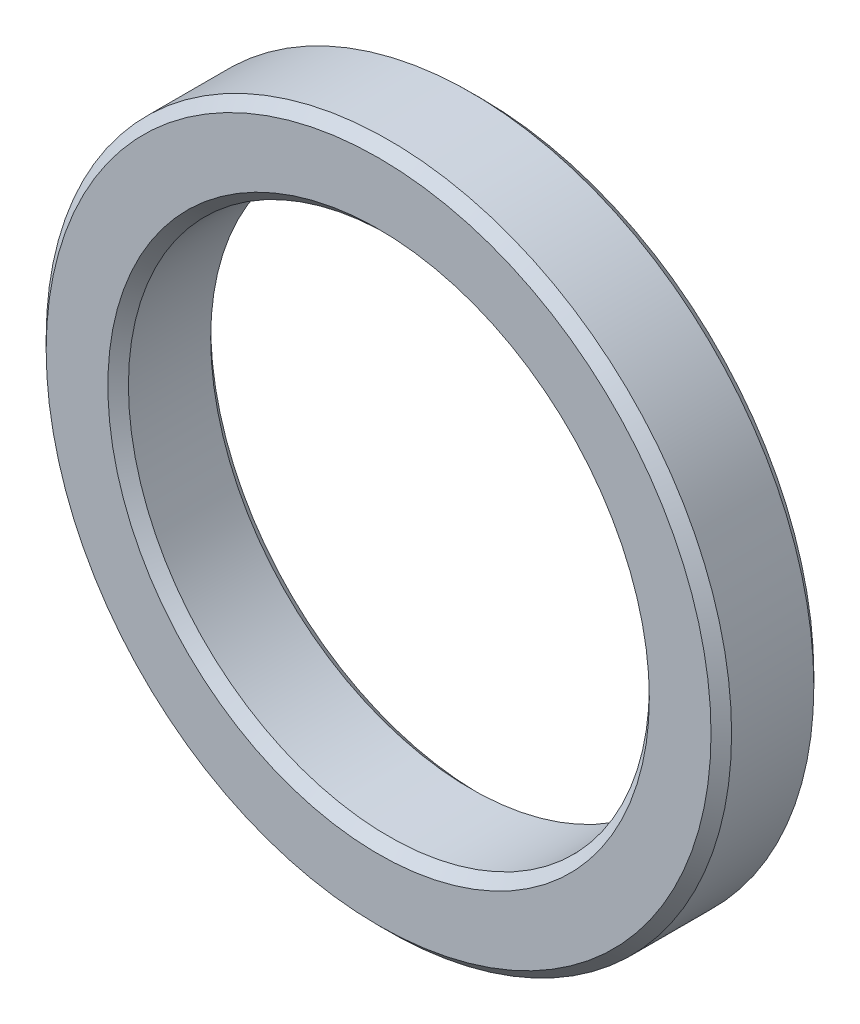
ISO-10303-21;
HEADER;
FILE_DESCRIPTION(('STEP AP214'),'2;1');
FILE_NAME('part.step','',(''),(''),'','','');
FILE_SCHEMA(('AUTOMOTIVE_DESIGN { 1 0 10303 214 1 1 1 1 }'));
ENDSEC;
DATA;
#1=APPLICATION_CONTEXT('core data for automotive mechanical design processes');
#2=APPLICATION_PROTOCOL_DEFINITION('international standard','automotive_design',2000,#1);
#3=PRODUCT_CONTEXT('',#1,'mechanical');
#4=PRODUCT('Part','Part','',(#3));
#5=PRODUCT_RELATED_PRODUCT_CATEGORY('part','',(#4));
#6=PRODUCT_DEFINITION_FORMATION('','',#4);
#7=PRODUCT_DEFINITION_CONTEXT('part definition',#1,'design');
#8=PRODUCT_DEFINITION('design','',#6,#7);
#9=PRODUCT_DEFINITION_SHAPE('','',#8);
#10=(LENGTH_UNIT() NAMED_UNIT(*) SI_UNIT(.MILLI.,.METRE.));
#11=(NAMED_UNIT(*) PLANE_ANGLE_UNIT() SI_UNIT($,.RADIAN.));
#12=(NAMED_UNIT(*) SI_UNIT($,.STERADIAN.) SOLID_ANGLE_UNIT());
#13=UNCERTAINTY_MEASURE_WITH_UNIT(LENGTH_MEASURE(1.E-05),#10,'distance_accuracy_value','');
#14=(GEOMETRIC_REPRESENTATION_CONTEXT(3) GLOBAL_UNCERTAINTY_ASSIGNED_CONTEXT((#13)) GLOBAL_UNIT_ASSIGNED_CONTEXT((#10,
#11,#12)) REPRESENTATION_CONTEXT('',''));
#15=CARTESIAN_POINT('',(0.,0.,0.));
#16=DIRECTION('',(0.,0.,1.));
#17=DIRECTION('',(1.,0.,0.));
#18=AXIS2_PLACEMENT_3D('',#15,#16,#17);
#19=CARTESIAN_POINT('',(0.,0.,3.));
#20=DIRECTION('',(0.,0.,1.));
#21=DIRECTION('',(1.,0.,0.));
#22=AXIS2_PLACEMENT_3D('',#19,#20,#21);
#23=PLANE('',#22);
#24=CARTESIAN_POINT('',(0.,0.,3.));
#25=DIRECTION('',(0.,0.,1.));
#26=DIRECTION('',(1.,0.,0.));
#27=AXIS2_PLACEMENT_3D('',#24,#25,#26);
#28=CIRCLE('',#27,9.7);
#29=CARTESIAN_POINT('',(9.7,0.,3.));
#30=VERTEX_POINT('',#29);
#31=EDGE_CURVE('E39',#30,#30,#28,.T.);
#32=ORIENTED_EDGE('',*,*,#31,.T.);
#33=EDGE_LOOP('',(#32));
#34=FACE_BOUND('',#33,.T.);
#35=CARTESIAN_POINT('',(0.,0.,3.));
#36=DIRECTION('',(0.,0.,1.));
#37=DIRECTION('',(1.,0.,0.));
#38=AXIS2_PLACEMENT_3D('',#35,#36,#37);
#39=CIRCLE('',#38,7.9);
#40=CARTESIAN_POINT('',(7.9,0.,3.));
#41=VERTEX_POINT('',#40);
#42=EDGE_CURVE('E43',#41,#41,#39,.F.);
#43=ORIENTED_EDGE('',*,*,#42,.T.);
#44=EDGE_LOOP('',(#43));
#45=FACE_BOUND('',#44,.T.);
#46=ADVANCED_FACE('F28',(#34,#45),#23,.T.);
#47=CARTESIAN_POINT('',(0.,0.,0.));
#48=DIRECTION('',(0.,0.,1.));
#49=DIRECTION('',(1.,0.,0.));
#50=AXIS2_PLACEMENT_3D('',#47,#48,#49);
#51=PLANE('',#50);
#52=CARTESIAN_POINT('',(0.,0.,0.));
#53=DIRECTION('',(0.,0.,1.));
#54=DIRECTION('',(1.,0.,0.));
#55=AXIS2_PLACEMENT_3D('',#52,#53,#54);
#56=CIRCLE('',#55,9.7);
#57=CARTESIAN_POINT('',(9.7,0.,0.));
#58=VERTEX_POINT('',#57);
#59=EDGE_CURVE('E48',#58,#58,#56,.F.);
#60=ORIENTED_EDGE('',*,*,#59,.T.);
#61=EDGE_LOOP('',(#60));
#62=FACE_BOUND('',#61,.T.);
#63=CARTESIAN_POINT('',(0.,0.,0.));
#64=DIRECTION('',(0.,0.,1.));
#65=DIRECTION('',(1.,0.,0.));
#66=AXIS2_PLACEMENT_3D('',#63,#64,#65);
#67=CIRCLE('',#66,7.9);
#68=CARTESIAN_POINT('',(7.9,0.,0.));
#69=VERTEX_POINT('',#68);
#70=EDGE_CURVE('E51',#69,#69,#67,.T.);
#71=ORIENTED_EDGE('',*,*,#70,.T.);
#72=EDGE_LOOP('',(#71));
#73=FACE_BOUND('',#72,.T.);
#74=ADVANCED_FACE('F73',(#62,#73),#51,.F.);
#75=CARTESIAN_POINT('',(0.,0.,3.));
#76=DIRECTION('',(0.,0.,-1.));
#77=DIRECTION('',(-1.,0.,0.));
#78=AXIS2_PLACEMENT_3D('',#75,#76,#77);
#79=CYLINDRICAL_SURFACE('',#78,10.);
#80=CARTESIAN_POINT('',(0.,0.,0.3));
#81=DIRECTION('',(0.,0.,1.));
#82=DIRECTION('',(1.,0.,0.));
#83=AXIS2_PLACEMENT_3D('',#80,#81,#82);
#84=CIRCLE('',#83,10.);
#85=CARTESIAN_POINT('',(10.,0.,0.3));
#86=VERTEX_POINT('',#85);
#87=EDGE_CURVE('E54',#86,#86,#84,.T.);
#88=ORIENTED_EDGE('',*,*,#87,.T.);
#89=EDGE_LOOP('',(#88));
#90=FACE_BOUND('',#89,.T.);
#91=CARTESIAN_POINT('',(0.,0.,2.7));
#92=DIRECTION('',(0.,0.,1.));
#93=DIRECTION('',(1.,0.,0.));
#94=AXIS2_PLACEMENT_3D('',#91,#92,#93);
#95=CIRCLE('',#94,10.);
#96=CARTESIAN_POINT('',(10.,0.,2.7));
#97=VERTEX_POINT('',#96);
#98=EDGE_CURVE('E57',#97,#97,#95,.F.);
#99=ORIENTED_EDGE('',*,*,#98,.T.);
#100=EDGE_LOOP('',(#99));
#101=FACE_BOUND('',#100,.T.);
#102=ADVANCED_FACE('F61',(#90,#101),#79,.T.);
#103=CARTESIAN_POINT('',(0.,0.,3.));
#104=DIRECTION('',(0.,0.,-1.));
#105=DIRECTION('',(-1.,0.,0.));
#106=AXIS2_PLACEMENT_3D('',#103,#104,#105);
#107=CYLINDRICAL_SURFACE('',#106,7.6);
#108=CARTESIAN_POINT('',(0.,0.,0.299999999999998));
#109=DIRECTION('',(0.,0.,1.));
#110=DIRECTION('',(1.,0.,0.));
#111=AXIS2_PLACEMENT_3D('',#108,#109,#110);
#112=CIRCLE('',#111,7.6);
#113=CARTESIAN_POINT('',(7.6,0.,0.299999999999998));
#114=VERTEX_POINT('',#113);
#115=EDGE_CURVE('E10',#114,#114,#112,.F.);
#116=ORIENTED_EDGE('',*,*,#115,.T.);
#117=EDGE_LOOP('',(#116));
#118=FACE_BOUND('',#117,.T.);
#119=CARTESIAN_POINT('',(0.,0.,2.70000000000001));
#120=DIRECTION('',(0.,0.,1.));
#121=DIRECTION('',(1.,0.,0.));
#122=AXIS2_PLACEMENT_3D('',#119,#120,#121);
#123=CIRCLE('',#122,7.6);
#124=CARTESIAN_POINT('',(7.6,0.,2.70000000000001));
#125=VERTEX_POINT('',#124);
#126=EDGE_CURVE('E35',#125,#125,#123,.T.);
#127=ORIENTED_EDGE('',*,*,#126,.T.);
#128=EDGE_LOOP('',(#127));
#129=FACE_BOUND('',#128,.T.);
#130=ADVANCED_FACE('F89',(#118,#129),#107,.F.);
#131=CARTESIAN_POINT('',(0.,0.,0.3));
#132=DIRECTION('',(0.,0.,1.));
#133=DIRECTION('',(1.,0.,0.));
#134=AXIS2_PLACEMENT_3D('',#131,#132,#133);
#135=CONICAL_SURFACE('',#134,10.,0.785398163397451);
#136=ORIENTED_EDGE('',*,*,#59,.F.);
#137=EDGE_LOOP('',(#136));
#138=FACE_BOUND('',#137,.T.);
#139=ORIENTED_EDGE('',*,*,#87,.F.);
#140=EDGE_LOOP('',(#139));
#141=FACE_BOUND('',#140,.T.);
#142=ADVANCED_FACE('F67',(#138,#141),#135,.T.);
#143=CARTESIAN_POINT('',(0.,0.,3.));
#144=DIRECTION('',(0.,0.,-1.));
#145=DIRECTION('',(-1.,0.,0.));
#146=AXIS2_PLACEMENT_3D('',#143,#144,#145);
#147=CONICAL_SURFACE('',#146,9.7,0.785398163397443);
#148=ORIENTED_EDGE('',*,*,#98,.F.);
#149=EDGE_LOOP('',(#148));
#150=FACE_BOUND('',#149,.T.);
#151=ORIENTED_EDGE('',*,*,#31,.F.);
#152=EDGE_LOOP('',(#151));
#153=FACE_BOUND('',#152,.T.);
#154=ADVANCED_FACE('F63',(#150,#153),#147,.T.);
#155=CARTESIAN_POINT('',(0.,0.,0.));
#156=DIRECTION('',(0.,0.,-1.));
#157=DIRECTION('',(-1.,0.,0.));
#158=AXIS2_PLACEMENT_3D('',#155,#156,#157);
#159=CONICAL_SURFACE('',#158,7.9,0.785398163397447);
#160=ORIENTED_EDGE('',*,*,#115,.F.);
#161=EDGE_LOOP('',(#160));
#162=FACE_BOUND('',#161,.T.);
#163=ORIENTED_EDGE('',*,*,#70,.F.);
#164=EDGE_LOOP('',(#163));
#165=FACE_BOUND('',#164,.T.);
#166=ADVANCED_FACE('F66',(#162,#165),#159,.F.);
#167=CARTESIAN_POINT('',(0.,0.,2.70000000000001));
#168=DIRECTION('',(0.,0.,1.));
#169=DIRECTION('',(1.,0.,0.));
#170=AXIS2_PLACEMENT_3D('',#167,#168,#169);
#171=CONICAL_SURFACE('',#170,7.6,0.785398163397454);
#172=ORIENTED_EDGE('',*,*,#42,.F.);
#173=EDGE_LOOP('',(#172));
#174=FACE_BOUND('',#173,.T.);
#175=ORIENTED_EDGE('',*,*,#126,.F.);
#176=EDGE_LOOP('',(#175));
#177=FACE_BOUND('',#176,.T.);
#178=ADVANCED_FACE('F30',(#174,#177),#171,.F.);
#179=CLOSED_SHELL('',(#46,#74,#102,#130,#142,#154,#166,#178));
#180=MANIFOLD_SOLID_BREP('B2',#179);
#181=ADVANCED_BREP_SHAPE_REPRESENTATION('',(#18,#180),#14);
#182=SHAPE_DEFINITION_REPRESENTATION(#9,#181);
ENDSEC;
END-ISO-10303-21;
